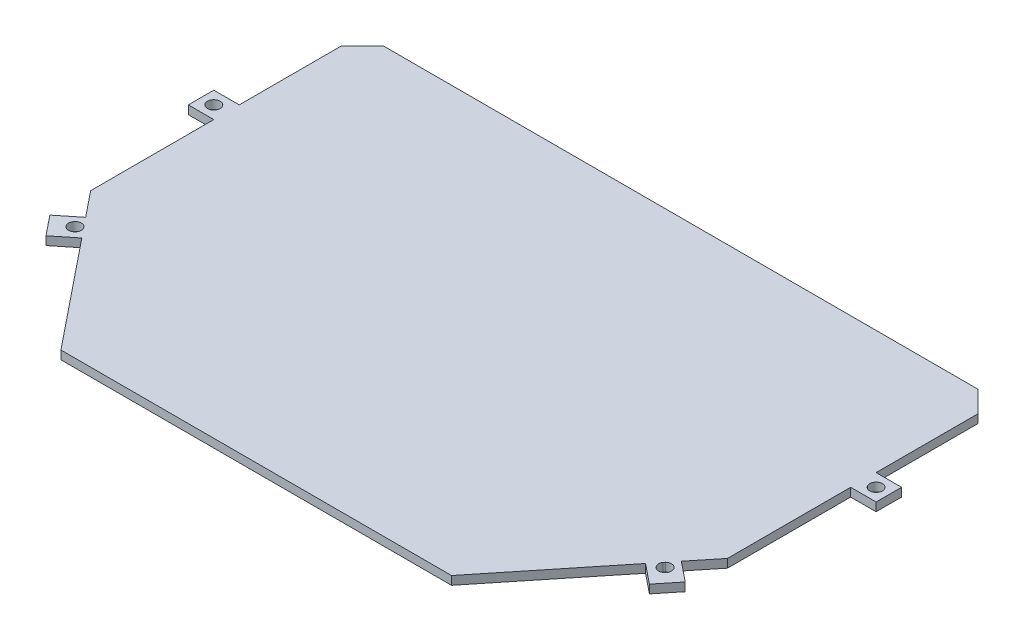
ISO-10303-21;
HEADER;
FILE_DESCRIPTION(('STEP AP214'),'2;1');
FILE_NAME('part.step','',(''),(''),'','','');
FILE_SCHEMA(('AUTOMOTIVE_DESIGN { 1 0 10303 214 1 1 1 1 }'));
ENDSEC;
DATA;
#1=APPLICATION_CONTEXT('core data for automotive mechanical design processes');
#2=APPLICATION_PROTOCOL_DEFINITION('international standard','automotive_design',2000,#1);
#3=PRODUCT_CONTEXT('',#1,'mechanical');
#4=PRODUCT('Part','Part','',(#3));
#5=PRODUCT_RELATED_PRODUCT_CATEGORY('part','',(#4));
#6=PRODUCT_DEFINITION_FORMATION('','',#4);
#7=PRODUCT_DEFINITION_CONTEXT('part definition',#1,'design');
#8=PRODUCT_DEFINITION('design','',#6,#7);
#9=PRODUCT_DEFINITION_SHAPE('','',#8);
#10=(LENGTH_UNIT() NAMED_UNIT(*) SI_UNIT(.MILLI.,.METRE.));
#11=(NAMED_UNIT(*) PLANE_ANGLE_UNIT() SI_UNIT($,.RADIAN.));
#12=(NAMED_UNIT(*) SI_UNIT($,.STERADIAN.) SOLID_ANGLE_UNIT());
#13=UNCERTAINTY_MEASURE_WITH_UNIT(LENGTH_MEASURE(1.E-05),#10,'distance_accuracy_value','');
#14=(GEOMETRIC_REPRESENTATION_CONTEXT(3) GLOBAL_UNCERTAINTY_ASSIGNED_CONTEXT((#13)) GLOBAL_UNIT_ASSIGNED_CONTEXT((#10,
#11,#12)) REPRESENTATION_CONTEXT('',''));
#15=CARTESIAN_POINT('',(0.,0.,0.));
#16=DIRECTION('',(0.,0.,1.));
#17=DIRECTION('',(1.,0.,0.));
#18=AXIS2_PLACEMENT_3D('',#15,#16,#17);
#19=CARTESIAN_POINT('',(-46.,2.,65.));
#20=DIRECTION('',(0.778753909083283,0.,-0.627329537872645));
#21=DIRECTION('',(-0.627329537872645,0.,-0.778753909083283));
#22=AXIS2_PLACEMENT_3D('',#19,#20,#21);
#23=PLANE('',#22);
#24=DIRECTION('',(0.,1.,0.));
#25=VECTOR('',#24,1.);
#26=CARTESIAN_POINT('',(-66.388209980861,-11.9310136830803,39.6904979547933));
#27=LINE('',#26,#25);
#28=CARTESIAN_POINT('',(-66.388209980861,0.,39.6904979547933));
#29=VERTEX_POINT('',#28);
#30=CARTESIAN_POINT('',(-66.3882099808609,2.,39.6904979547933));
#31=VERTEX_POINT('',#30);
#32=EDGE_CURVE('E235',#29,#31,#27,.T.);
#33=ORIENTED_EDGE('',*,*,#32,.F.);
#34=DIRECTION('',(0.627329537872645,0.,0.778753909083283));
#35=VECTOR('',#34,1.);
#36=CARTESIAN_POINT('',(-46.,0.,65.));
#37=LINE('',#36,#35);
#38=CARTESIAN_POINT('',(-46.,0.,65.));
#39=VERTEX_POINT('',#38);
#40=EDGE_CURVE('E334',#29,#39,#37,.T.);
#41=ORIENTED_EDGE('',*,*,#40,.T.);
#42=DIRECTION('',(0.,-1.,0.));
#43=VECTOR('',#42,1.);
#44=CARTESIAN_POINT('',(-46.,2.,65.));
#45=LINE('',#44,#43);
#46=CARTESIAN_POINT('',(-46.,2.,65.));
#47=VERTEX_POINT('',#46);
#48=EDGE_CURVE('E355',#47,#39,#45,.T.);
#49=ORIENTED_EDGE('',*,*,#48,.F.);
#50=DIRECTION('',(0.627329537872645,0.,0.778753909083283));
#51=VECTOR('',#50,1.);
#52=CARTESIAN_POINT('',(-46.,2.,65.));
#53=LINE('',#52,#51);
#54=EDGE_CURVE('E53',#31,#47,#53,.T.);
#55=ORIENTED_EDGE('',*,*,#54,.F.);
#56=EDGE_LOOP('',(#33,#41,#49,#55));
#57=FACE_BOUND('',#56,.T.);
#58=ADVANCED_FACE('F36',(#57),#23,.F.);
#59=CARTESIAN_POINT('',(-75.,0.,29.));
#60=VERTEX_POINT('',#59);
#61=CARTESIAN_POINT('',(-70.1521872080968,0.,35.0179745002936));
#62=VERTEX_POINT('',#61);
#63=EDGE_CURVE('E329',#60,#62,#37,.T.);
#64=ORIENTED_EDGE('',*,*,#63,.T.);
#65=DIRECTION('',(0.,1.,0.));
#66=VECTOR('',#65,1.);
#67=CARTESIAN_POINT('',(-70.1521872080968,-11.9310136830803,35.0179745002936));
#68=LINE('',#67,#66);
#69=CARTESIAN_POINT('',(-70.1521872080968,2.,35.0179745002936));
#70=VERTEX_POINT('',#69);
#71=EDGE_CURVE('E247',#62,#70,#68,.T.);
#72=ORIENTED_EDGE('',*,*,#71,.T.);
#73=CARTESIAN_POINT('',(-75.,2.,29.));
#74=VERTEX_POINT('',#73);
#75=EDGE_CURVE('E387',#74,#70,#53,.T.);
#76=ORIENTED_EDGE('',*,*,#75,.F.);
#77=DIRECTION('',(0.,-1.,0.));
#78=VECTOR('',#77,1.);
#79=CARTESIAN_POINT('',(-75.,2.,29.));
#80=LINE('',#79,#78);
#81=EDGE_CURVE('E351',#74,#60,#80,.T.);
#82=ORIENTED_EDGE('',*,*,#81,.T.);
#83=EDGE_LOOP('',(#64,#72,#76,#82));
#84=FACE_BOUND('',#83,.T.);
#85=ADVANCED_FACE('F544',(#84),#23,.F.);
#86=CARTESIAN_POINT('',(-75.,2.,29.));
#87=DIRECTION('',(1.,0.,0.));
#88=DIRECTION('',(0.,0.,-1.));
#89=AXIS2_PLACEMENT_3D('',#86,#87,#88);
#90=PLANE('',#89);
#91=DIRECTION('',(0.,1.,0.));
#92=VECTOR('',#91,1.);
#93=CARTESIAN_POINT('',(-75.,-11.9310136830803,0.));
#94=LINE('',#93,#92);
#95=CARTESIAN_POINT('',(-75.,0.,0.));
#96=VERTEX_POINT('',#95);
#97=CARTESIAN_POINT('',(-75.,2.,0.));
#98=VERTEX_POINT('',#97);
#99=EDGE_CURVE('E286',#96,#98,#94,.T.);
#100=ORIENTED_EDGE('',*,*,#99,.F.);
#101=DIRECTION('',(0.,0.,1.));
#102=VECTOR('',#101,1.);
#103=CARTESIAN_POINT('',(-75.,0.,29.));
#104=LINE('',#103,#102);
#105=EDGE_CURVE('E318',#96,#60,#104,.T.);
#106=ORIENTED_EDGE('',*,*,#105,.T.);
#107=ORIENTED_EDGE('',*,*,#81,.F.);
#108=DIRECTION('',(0.,0.,1.));
#109=VECTOR('',#108,1.);
#110=CARTESIAN_POINT('',(-75.,2.,29.));
#111=LINE('',#110,#109);
#112=EDGE_CURVE('E395',#98,#74,#111,.T.);
#113=ORIENTED_EDGE('',*,*,#112,.F.);
#114=EDGE_LOOP('',(#100,#106,#107,#113));
#115=FACE_BOUND('',#114,.T.);
#116=ADVANCED_FACE('F550',(#115),#90,.F.);
#117=CARTESIAN_POINT('',(75.,2.,29.));
#118=DIRECTION('',(-0.778753909083283,0.,-0.627329537872644));
#119=DIRECTION('',(-0.627329537872644,0.,0.778753909083283));
#120=AXIS2_PLACEMENT_3D('',#117,#118,#119);
#121=PLANE('',#120);
#122=DIRECTION('',(0.,1.,0.));
#123=VECTOR('',#122,1.);
#124=CARTESIAN_POINT('',(68.2008387655957,-11.9310136830803,37.4403380840881));
#125=LINE('',#124,#123);
#126=CARTESIAN_POINT('',(68.2008387655957,0.,37.4403380840881));
#127=VERTEX_POINT('',#126);
#128=CARTESIAN_POINT('',(68.2008387655957,2.,37.4403380840881));
#129=VERTEX_POINT('',#128);
#130=EDGE_CURVE('E290',#127,#129,#125,.T.);
#131=ORIENTED_EDGE('',*,*,#130,.F.);
#132=DIRECTION('',(0.627329537872644,0.,-0.778753909083283));
#133=VECTOR('',#132,1.);
#134=CARTESIAN_POINT('',(75.,0.,29.));
#135=LINE('',#134,#133);
#136=CARTESIAN_POINT('',(68.4820478943575,0.,37.0912508897631));
#137=VERTEX_POINT('',#136);
#138=EDGE_CURVE('E340',#127,#137,#135,.T.);
#139=ORIENTED_EDGE('',*,*,#138,.T.);
#140=DIRECTION('',(0.,1.,0.));
#141=VECTOR('',#140,1.);
#142=CARTESIAN_POINT('',(68.4820478943575,-11.9310136830803,37.0912508897631));
#143=LINE('',#142,#141);
#144=CARTESIAN_POINT('',(68.4820478943575,2.,37.0912508897631));
#145=VERTEX_POINT('',#144);
#146=EDGE_CURVE('E472',#137,#145,#143,.T.);
#147=ORIENTED_EDGE('',*,*,#146,.T.);
#148=DIRECTION('',(0.627329537872644,0.,-0.778753909083283));
#149=VECTOR('',#148,1.);
#150=CARTESIAN_POINT('',(75.,2.,29.));
#151=LINE('',#150,#149);
#152=EDGE_CURVE('E383',#129,#145,#151,.T.);
#153=ORIENTED_EDGE('',*,*,#152,.F.);
#154=EDGE_LOOP('',(#131,#139,#147,#153));
#155=FACE_BOUND('',#154,.T.);
#156=ADVANCED_FACE('F518',(#155),#121,.F.);
#157=DIRECTION('',(0.,1.,0.));
#158=VECTOR('',#157,1.);
#159=CARTESIAN_POINT('',(70.1521872080968,-11.9310136830803,35.0179745002936));
#160=LINE('',#159,#158);
#161=CARTESIAN_POINT('',(70.1521872080968,0.,35.0179745002936));
#162=VERTEX_POINT('',#161);
#163=CARTESIAN_POINT('',(70.1521872080968,2.,35.0179745002936));
#164=VERTEX_POINT('',#163);
#165=EDGE_CURVE('E469',#162,#164,#160,.T.);
#166=ORIENTED_EDGE('',*,*,#165,.F.);
#167=CARTESIAN_POINT('',(75.,0.,29.));
#168=VERTEX_POINT('',#167);
#169=EDGE_CURVE('E336',#162,#168,#135,.T.);
#170=ORIENTED_EDGE('',*,*,#169,.T.);
#171=DIRECTION('',(0.,-1.,0.));
#172=VECTOR('',#171,1.);
#173=CARTESIAN_POINT('',(75.,2.,29.));
#174=LINE('',#173,#172);
#175=CARTESIAN_POINT('',(75.,2.,29.));
#176=VERTEX_POINT('',#175);
#177=EDGE_CURVE('E360',#176,#168,#174,.T.);
#178=ORIENTED_EDGE('',*,*,#177,.F.);
#179=EDGE_CURVE('E384',#164,#176,#151,.T.);
#180=ORIENTED_EDGE('',*,*,#179,.F.);
#181=EDGE_LOOP('',(#166,#170,#178,#180));
#182=FACE_BOUND('',#181,.T.);
#183=ADVANCED_FACE('F507',(#182),#121,.F.);
#184=CARTESIAN_POINT('',(75.,2.,-35.));
#185=DIRECTION('',(-1.,0.,0.));
#186=DIRECTION('',(0.,0.,1.));
#187=AXIS2_PLACEMENT_3D('',#184,#185,#186);
#188=PLANE('',#187);
#189=DIRECTION('',(0.,0.,-1.));
#190=VECTOR('',#189,1.);
#191=CARTESIAN_POINT('',(75.,0.,-35.));
#192=LINE('',#191,#190);
#193=CARTESIAN_POINT('',(75.,0.,-6.));
#194=VERTEX_POINT('',#193);
#195=CARTESIAN_POINT('',(75.,0.,-30.));
#196=VERTEX_POINT('',#195);
#197=EDGE_CURVE('E339',#194,#196,#192,.T.);
#198=ORIENTED_EDGE('',*,*,#197,.T.);
#199=DIRECTION('',(0.,1.,0.));
#200=VECTOR('',#199,1.);
#201=CARTESIAN_POINT('',(75.,2.,-30.));
#202=LINE('',#201,#200);
#203=CARTESIAN_POINT('',(75.,2.,-30.));
#204=VERTEX_POINT('',#203);
#205=EDGE_CURVE('E402',#196,#204,#202,.T.);
#206=ORIENTED_EDGE('',*,*,#205,.T.);
#207=DIRECTION('',(0.,0.,-1.));
#208=VECTOR('',#207,1.);
#209=CARTESIAN_POINT('',(75.,2.,-35.));
#210=LINE('',#209,#208);
#211=CARTESIAN_POINT('',(75.,2.,-6.));
#212=VERTEX_POINT('',#211);
#213=EDGE_CURVE('E371',#212,#204,#210,.T.);
#214=ORIENTED_EDGE('',*,*,#213,.F.);
#215=DIRECTION('',(0.,1.,0.));
#216=VECTOR('',#215,1.);
#217=CARTESIAN_POINT('',(75.,-11.9310136830803,-6.));
#218=LINE('',#217,#216);
#219=EDGE_CURVE('E426',#194,#212,#218,.T.);
#220=ORIENTED_EDGE('',*,*,#219,.F.);
#221=EDGE_LOOP('',(#198,#206,#214,#220));
#222=FACE_BOUND('',#221,.T.);
#223=ADVANCED_FACE('F563',(#222),#188,.F.);
#224=CARTESIAN_POINT('',(-75.,0.,-30.));
#225=VERTEX_POINT('',#224);
#226=CARTESIAN_POINT('',(-75.,0.,-6.));
#227=VERTEX_POINT('',#226);
#228=EDGE_CURVE('E321',#225,#227,#104,.T.);
#229=ORIENTED_EDGE('',*,*,#228,.T.);
#230=DIRECTION('',(0.,1.,0.));
#231=VECTOR('',#230,1.);
#232=CARTESIAN_POINT('',(-75.,-11.9310136830803,-6.));
#233=LINE('',#232,#231);
#234=CARTESIAN_POINT('',(-75.,2.,-6.));
#235=VERTEX_POINT('',#234);
#236=EDGE_CURVE('E293',#227,#235,#233,.T.);
#237=ORIENTED_EDGE('',*,*,#236,.T.);
#238=CARTESIAN_POINT('',(-75.,2.,-30.));
#239=VERTEX_POINT('',#238);
#240=EDGE_CURVE('E397',#239,#235,#111,.T.);
#241=ORIENTED_EDGE('',*,*,#240,.F.);
#242=DIRECTION('',(0.,-1.,0.));
#243=VECTOR('',#242,1.);
#244=CARTESIAN_POINT('',(-75.,2.,-30.));
#245=LINE('',#244,#243);
#246=EDGE_CURVE('E11',#239,#225,#245,.T.);
#247=ORIENTED_EDGE('',*,*,#246,.T.);
#248=EDGE_LOOP('',(#229,#237,#241,#247));
#249=FACE_BOUND('',#248,.T.);
#250=ADVANCED_FACE('F556',(#249),#90,.F.);
#251=CARTESIAN_POINT('',(-68.4820478943574,2.,37.0912508897632));
#252=VERTEX_POINT('',#251);
#253=CARTESIAN_POINT('',(-68.2008387655958,2.,37.440338084088));
#254=VERTEX_POINT('',#253);
#255=EDGE_CURVE('E389',#252,#254,#53,.T.);
#256=ORIENTED_EDGE('',*,*,#255,.F.);
#257=DIRECTION('',(0.,1.,0.));
#258=VECTOR('',#257,1.);
#259=CARTESIAN_POINT('',(-68.4820478943575,-11.9310136830803,37.0912508897631));
#260=LINE('',#259,#258);
#261=CARTESIAN_POINT('',(-68.4820478943575,0.,37.0912508897631));
#262=VERTEX_POINT('',#261);
#263=EDGE_CURVE('E260',#262,#252,#260,.T.);
#264=ORIENTED_EDGE('',*,*,#263,.F.);
#265=CARTESIAN_POINT('',(-68.2008387655958,0.,37.440338084088));
#266=VERTEX_POINT('',#265);
#267=EDGE_CURVE('E333',#262,#266,#37,.T.);
#268=ORIENTED_EDGE('',*,*,#267,.T.);
#269=DIRECTION('',(0.,1.,0.));
#270=VECTOR('',#269,1.);
#271=CARTESIAN_POINT('',(-68.2008387655957,-11.9310136830803,37.4403380840881));
#272=LINE('',#271,#270);
#273=EDGE_CURVE('E61',#266,#254,#272,.T.);
#274=ORIENTED_EDGE('',*,*,#273,.T.);
#275=EDGE_LOOP('',(#256,#264,#268,#274));
#276=FACE_BOUND('',#275,.T.);
#277=ADVANCED_FACE('F546',(#276),#23,.F.);
#278=CARTESIAN_POINT('',(46.,2.,65.));
#279=DIRECTION('',(0.,0.,-1.));
#280=DIRECTION('',(-1.,0.,0.));
#281=AXIS2_PLACEMENT_3D('',#278,#279,#280);
#282=PLANE('',#281);
#283=DIRECTION('',(1.,0.,0.));
#284=VECTOR('',#283,1.);
#285=CARTESIAN_POINT('',(46.,0.,65.));
#286=LINE('',#285,#284);
#287=CARTESIAN_POINT('',(46.,0.,65.));
#288=VERTEX_POINT('',#287);
#289=EDGE_CURVE('E332',#39,#288,#286,.T.);
#290=ORIENTED_EDGE('',*,*,#289,.T.);
#291=DIRECTION('',(0.,-1.,0.));
#292=VECTOR('',#291,1.);
#293=CARTESIAN_POINT('',(46.,2.,65.));
#294=LINE('',#293,#292);
#295=CARTESIAN_POINT('',(46.,2.,65.));
#296=VERTEX_POINT('',#295);
#297=EDGE_CURVE('E358',#296,#288,#294,.T.);
#298=ORIENTED_EDGE('',*,*,#297,.F.);
#299=DIRECTION('',(1.,0.,0.));
#300=VECTOR('',#299,1.);
#301=CARTESIAN_POINT('',(46.,2.,65.));
#302=LINE('',#301,#300);
#303=EDGE_CURVE('E385',#47,#296,#302,.T.);
#304=ORIENTED_EDGE('',*,*,#303,.F.);
#305=ORIENTED_EDGE('',*,*,#48,.T.);
#306=EDGE_LOOP('',(#290,#298,#304,#305));
#307=FACE_BOUND('',#306,.T.);
#308=ADVANCED_FACE('F555',(#307),#282,.F.);
#309=CARTESIAN_POINT('',(66.388209980861,0.,39.6904979547933));
#310=VERTEX_POINT('',#309);
#311=EDGE_CURVE('E337',#288,#310,#135,.T.);
#312=ORIENTED_EDGE('',*,*,#311,.T.);
#313=DIRECTION('',(0.,1.,0.));
#314=VECTOR('',#313,1.);
#315=CARTESIAN_POINT('',(66.388209980861,-11.9310136830803,39.6904979547933));
#316=LINE('',#315,#314);
#317=CARTESIAN_POINT('',(66.388209980861,2.,39.6904979547933));
#318=VERTEX_POINT('',#317);
#319=EDGE_CURVE('E459',#310,#318,#316,.T.);
#320=ORIENTED_EDGE('',*,*,#319,.T.);
#321=EDGE_CURVE('E375',#296,#318,#151,.T.);
#322=ORIENTED_EDGE('',*,*,#321,.F.);
#323=ORIENTED_EDGE('',*,*,#297,.T.);
#324=EDGE_LOOP('',(#312,#320,#322,#323));
#325=FACE_BOUND('',#324,.T.);
#326=ADVANCED_FACE('F561',(#325),#121,.F.);
#327=CARTESIAN_POINT('',(75.,0.,0.));
#328=VERTEX_POINT('',#327);
#329=EDGE_CURVE('E349',#168,#328,#192,.T.);
#330=ORIENTED_EDGE('',*,*,#329,.T.);
#331=DIRECTION('',(0.,1.,0.));
#332=VECTOR('',#331,1.);
#333=CARTESIAN_POINT('',(75.,-11.9310136830803,0.));
#334=LINE('',#333,#332);
#335=CARTESIAN_POINT('',(75.,2.,0.));
#336=VERTEX_POINT('',#335);
#337=EDGE_CURVE('E416',#328,#336,#334,.T.);
#338=ORIENTED_EDGE('',*,*,#337,.T.);
#339=EDGE_CURVE('E367',#176,#336,#210,.T.);
#340=ORIENTED_EDGE('',*,*,#339,.F.);
#341=ORIENTED_EDGE('',*,*,#177,.T.);
#342=EDGE_LOOP('',(#330,#338,#340,#341));
#343=FACE_BOUND('',#342,.T.);
#344=ADVANCED_FACE('F576',(#343),#188,.F.);
#345=CARTESIAN_POINT('',(-75.,2.,-35.));
#346=DIRECTION('',(0.,0.,1.));
#347=DIRECTION('',(1.,0.,0.));
#348=AXIS2_PLACEMENT_3D('',#345,#346,#347);
#349=PLANE('',#348);
#350=DIRECTION('',(-1.,0.,0.));
#351=VECTOR('',#350,1.);
#352=CARTESIAN_POINT('',(-75.,2.,-35.));
#353=LINE('',#352,#351);
#354=CARTESIAN_POINT('',(70.,2.,-35.));
#355=VERTEX_POINT('',#354);
#356=CARTESIAN_POINT('',(-70.,2.,-35.));
#357=VERTEX_POINT('',#356);
#358=EDGE_CURVE('E327',#355,#357,#353,.T.);
#359=ORIENTED_EDGE('',*,*,#358,.F.);
#360=DIRECTION('',(0.,-1.,0.));
#361=VECTOR('',#360,1.);
#362=CARTESIAN_POINT('',(70.,2.,-35.));
#363=LINE('',#362,#361);
#364=CARTESIAN_POINT('',(70.,0.,-35.));
#365=VERTEX_POINT('',#364);
#366=EDGE_CURVE('E408',#355,#365,#363,.T.);
#367=ORIENTED_EDGE('',*,*,#366,.T.);
#368=DIRECTION('',(-1.,0.,0.));
#369=VECTOR('',#368,1.);
#370=CARTESIAN_POINT('',(-75.,0.,-35.));
#371=LINE('',#370,#369);
#372=CARTESIAN_POINT('',(-70.,0.,-35.));
#373=VERTEX_POINT('',#372);
#374=EDGE_CURVE('E343',#365,#373,#371,.T.);
#375=ORIENTED_EDGE('',*,*,#374,.T.);
#376=DIRECTION('',(0.,1.,0.));
#377=VECTOR('',#376,1.);
#378=CARTESIAN_POINT('',(-70.,2.,-35.));
#379=LINE('',#378,#377);
#380=EDGE_CURVE('E354',#373,#357,#379,.T.);
#381=ORIENTED_EDGE('',*,*,#380,.T.);
#382=EDGE_LOOP('',(#359,#367,#375,#381));
#383=FACE_BOUND('',#382,.T.);
#384=ADVANCED_FACE('F571',(#383),#349,.F.);
#385=CARTESIAN_POINT('',(-75.,2.,-35.));
#386=DIRECTION('',(0.,-1.,0.));
#387=DIRECTION('',(0.,0.,-1.));
#388=AXIS2_PLACEMENT_3D('',#385,#386,#387);
#389=PLANE('',#388);
#390=ORIENTED_EDGE('',*,*,#75,.T.);
#391=DIRECTION('',(-0.778753909083286,0.,0.627329537872641));
#392=VECTOR('',#391,1.);
#393=CARTESIAN_POINT('',(67.2967306871452,2.,-75.7047649153171));
#394=LINE('',#393,#392);
#395=CARTESIAN_POINT('',(-74.8247106625965,2.,38.7819517275294));
#396=VERTEX_POINT('',#395);
#397=EDGE_CURVE('E246',#70,#396,#394,.T.);
#398=ORIENTED_EDGE('',*,*,#397,.T.);
#399=DIRECTION('',(0.627329537872643,0.,0.778753909083284));
#400=VECTOR('',#399,1.);
#401=CARTESIAN_POINT('',(-1.7569833697024,2.,129.486716642847));
#402=LINE('',#401,#400);
#403=CARTESIAN_POINT('',(-71.0607334353607,2.,43.4544751820291));
#404=VERTEX_POINT('',#403);
#405=EDGE_CURVE('E230',#396,#404,#402,.T.);
#406=ORIENTED_EDGE('',*,*,#405,.T.);
#407=DIRECTION('',(-0.778753909083284,0.,0.627329537872643));
#408=VECTOR('',#407,1.);
#409=CARTESIAN_POINT('',(71.0607079143806,2.,-71.0322414608175));
#410=LINE('',#409,#408);
#411=EDGE_CURVE('E238',#31,#404,#410,.T.);
#412=ORIENTED_EDGE('',*,*,#411,.F.);
#413=ORIENTED_EDGE('',*,*,#54,.T.);
#414=ORIENTED_EDGE('',*,*,#303,.T.);
#415=ORIENTED_EDGE('',*,*,#321,.T.);
#416=DIRECTION('',(0.778753909083284,0.,0.627329537872643));
#417=VECTOR('',#416,1.);
#418=CARTESIAN_POINT('',(-71.0607079143806,2.,-71.0322414608175));
#419=LINE('',#418,#417);
#420=CARTESIAN_POINT('',(71.0607334353607,2.,43.4544751820291));
#421=VERTEX_POINT('',#420);
#422=EDGE_CURVE('E461',#318,#421,#419,.T.);
#423=ORIENTED_EDGE('',*,*,#422,.T.);
#424=DIRECTION('',(-0.627329537872643,0.,0.778753909083284));
#425=VECTOR('',#424,1.);
#426=CARTESIAN_POINT('',(1.7569833697024,2.,129.486716642847));
#427=LINE('',#426,#425);
#428=CARTESIAN_POINT('',(74.8247106625965,2.,38.7819517275294));
#429=VERTEX_POINT('',#428);
#430=EDGE_CURVE('E467',#429,#421,#427,.T.);
#431=ORIENTED_EDGE('',*,*,#430,.F.);
#432=DIRECTION('',(0.778753909083286,0.,0.627329537872641));
#433=VECTOR('',#432,1.);
#434=CARTESIAN_POINT('',(-67.2967306871452,2.,-75.7047649153171));
#435=LINE('',#434,#433);
#436=EDGE_CURVE('E468',#164,#429,#435,.T.);
#437=ORIENTED_EDGE('',*,*,#436,.F.);
#438=ORIENTED_EDGE('',*,*,#179,.T.);
#439=ORIENTED_EDGE('',*,*,#339,.T.);
#440=DIRECTION('',(-1.,0.,0.));
#441=VECTOR('',#440,1.);
#442=CARTESIAN_POINT('',(-140.364457980039,2.,0.));
#443=LINE('',#442,#441);
#444=CARTESIAN_POINT('',(81.,2.,0.));
#445=VERTEX_POINT('',#444);
#446=EDGE_CURVE('E414',#445,#336,#443,.T.);
#447=ORIENTED_EDGE('',*,*,#446,.F.);
#448=DIRECTION('',(0.,0.,1.));
#449=VECTOR('',#448,1.);
#450=CARTESIAN_POINT('',(81.,2.,15.));
#451=LINE('',#450,#449);
#452=CARTESIAN_POINT('',(81.,2.,-6.));
#453=VERTEX_POINT('',#452);
#454=EDGE_CURVE('E453',#453,#445,#451,.T.);
#455=ORIENTED_EDGE('',*,*,#454,.F.);
#456=DIRECTION('',(1.,0.,0.));
#457=VECTOR('',#456,1.);
#458=CARTESIAN_POINT('',(-140.364457980039,2.,-6.));
#459=LINE('',#458,#457);
#460=EDGE_CURVE('E437',#212,#453,#459,.T.);
#461=ORIENTED_EDGE('',*,*,#460,.F.);
#462=ORIENTED_EDGE('',*,*,#213,.T.);
#463=DIRECTION('',(0.707106781186549,0.,0.707106781186546));
#464=VECTOR('',#463,1.);
#465=CARTESIAN_POINT('',(70.,2.,-35.));
#466=LINE('',#465,#464);
#467=EDGE_CURVE('E45',#204,#355,#466,.F.);
#468=ORIENTED_EDGE('',*,*,#467,.T.);
#469=ORIENTED_EDGE('',*,*,#358,.T.);
#470=DIRECTION('',(0.707106781186549,0.,-0.707106781186546));
#471=VECTOR('',#470,1.);
#472=CARTESIAN_POINT('',(-75.,2.,-30.));
#473=LINE('',#472,#471);
#474=EDGE_CURVE('E400',#357,#239,#473,.F.);
#475=ORIENTED_EDGE('',*,*,#474,.T.);
#476=ORIENTED_EDGE('',*,*,#240,.T.);
#477=DIRECTION('',(-1.,0.,0.));
#478=VECTOR('',#477,1.);
#479=CARTESIAN_POINT('',(140.364457980039,2.,-6.));
#480=LINE('',#479,#478);
#481=CARTESIAN_POINT('',(-81.,2.,-6.));
#482=VERTEX_POINT('',#481);
#483=EDGE_CURVE('E287',#235,#482,#480,.T.);
#484=ORIENTED_EDGE('',*,*,#483,.T.);
#485=DIRECTION('',(0.,0.,1.));
#486=VECTOR('',#485,1.);
#487=CARTESIAN_POINT('',(-81.,2.,15.));
#488=LINE('',#487,#486);
#489=CARTESIAN_POINT('',(-81.,2.,0.));
#490=VERTEX_POINT('',#489);
#491=EDGE_CURVE('E283',#482,#490,#488,.T.);
#492=ORIENTED_EDGE('',*,*,#491,.T.);
#493=DIRECTION('',(1.,0.,0.));
#494=VECTOR('',#493,1.);
#495=CARTESIAN_POINT('',(140.364457980039,2.,0.));
#496=LINE('',#495,#494);
#497=EDGE_CURVE('E282',#490,#98,#496,.T.);
#498=ORIENTED_EDGE('',*,*,#497,.T.);
#499=ORIENTED_EDGE('',*,*,#112,.T.);
#500=EDGE_LOOP('',(#390,#398,#406,#412,#413,#414,#415,#423,#431,#437,#438,#439,#447,#455,#461,
#462,#468,#469,#475,#476,#484,#492,#498,#499));
#501=FACE_BOUND('',#500,.T.);
#502=CARTESIAN_POINT('',(-69.49646032,2.,38.19622484));
#503=DIRECTION('',(0.,-1.,0.));
#504=DIRECTION('',(0.,0.,1.));
#505=AXIS2_PLACEMENT_3D('',#502,#503,#504);
#506=CIRCLE('',#505,1.49999999999998);
#507=EDGE_CURVE('E251',#254,#252,#506,.T.);
#508=ORIENTED_EDGE('',*,*,#507,.T.);
#509=ORIENTED_EDGE('',*,*,#255,.T.);
#510=EDGE_LOOP('',(#508,#509));
#511=FACE_BOUND('',#510,.T.);
#512=ORIENTED_EDGE('',*,*,#152,.T.);
#513=CARTESIAN_POINT('',(69.49646032,2.,38.19622484));
#514=DIRECTION('',(0.,1.,0.));
#515=DIRECTION('',(0.,0.,1.));
#516=AXIS2_PLACEMENT_3D('',#513,#514,#515);
#517=CIRCLE('',#516,1.49999999999998);
#518=EDGE_CURVE('E458',#129,#145,#517,.T.);
#519=ORIENTED_EDGE('',*,*,#518,.F.);
#520=EDGE_LOOP('',(#512,#519));
#521=FACE_BOUND('',#520,.T.);
#522=CARTESIAN_POINT('',(78.,2.,-3.));
#523=DIRECTION('',(0.,1.,0.));
#524=DIRECTION('',(0.,0.,1.));
#525=AXIS2_PLACEMENT_3D('',#522,#523,#524);
#526=CIRCLE('',#525,1.5);
#527=CARTESIAN_POINT('',(78.,2.,-1.5));
#528=VERTEX_POINT('',#527);
#529=EDGE_CURVE('E440',#528,#528,#526,.T.);
#530=ORIENTED_EDGE('',*,*,#529,.F.);
#531=EDGE_LOOP('',(#530));
#532=FACE_BOUND('',#531,.T.);
#533=CARTESIAN_POINT('',(-78.,2.,-3.));
#534=DIRECTION('',(0.,-1.,0.));
#535=DIRECTION('',(0.,0.,1.));
#536=AXIS2_PLACEMENT_3D('',#533,#534,#535);
#537=CIRCLE('',#536,1.5);
#538=CARTESIAN_POINT('',(-78.,2.,-1.5));
#539=VERTEX_POINT('',#538);
#540=EDGE_CURVE('E279',#539,#539,#537,.T.);
#541=ORIENTED_EDGE('',*,*,#540,.T.);
#542=EDGE_LOOP('',(#541));
#543=FACE_BOUND('',#542,.T.);
#544=ADVANCED_FACE('F243',(#501,#511,#521,#532,#543),#389,.F.);
#545=CARTESIAN_POINT('',(-75.,0.,-35.));
#546=DIRECTION('',(0.,-1.,0.));
#547=DIRECTION('',(0.,0.,-1.));
#548=AXIS2_PLACEMENT_3D('',#545,#546,#547);
#549=PLANE('',#548);
#550=DIRECTION('',(-0.778753909083286,0.,0.627329537872641));
#551=VECTOR('',#550,1.);
#552=CARTESIAN_POINT('',(67.2967306871452,0.,-75.7047649153171));
#553=LINE('',#552,#551);
#554=CARTESIAN_POINT('',(-74.8247106625965,0.,38.7819517275294));
#555=VERTEX_POINT('',#554);
#556=EDGE_CURVE('E249',#62,#555,#553,.T.);
#557=ORIENTED_EDGE('',*,*,#556,.F.);
#558=ORIENTED_EDGE('',*,*,#63,.F.);
#559=ORIENTED_EDGE('',*,*,#105,.F.);
#560=DIRECTION('',(1.,0.,0.));
#561=VECTOR('',#560,1.);
#562=CARTESIAN_POINT('',(140.364457980039,0.,0.));
#563=LINE('',#562,#561);
#564=CARTESIAN_POINT('',(-81.,0.,0.));
#565=VERTEX_POINT('',#564);
#566=EDGE_CURVE('E275',#565,#96,#563,.T.);
#567=ORIENTED_EDGE('',*,*,#566,.F.);
#568=DIRECTION('',(0.,0.,1.));
#569=VECTOR('',#568,1.);
#570=CARTESIAN_POINT('',(-81.,0.,15.));
#571=LINE('',#570,#569);
#572=CARTESIAN_POINT('',(-81.,0.,-6.));
#573=VERTEX_POINT('',#572);
#574=EDGE_CURVE('E272',#573,#565,#571,.T.);
#575=ORIENTED_EDGE('',*,*,#574,.F.);
#576=DIRECTION('',(-1.,0.,0.));
#577=VECTOR('',#576,1.);
#578=CARTESIAN_POINT('',(140.364457980039,0.,-6.));
#579=LINE('',#578,#577);
#580=EDGE_CURVE('E271',#227,#573,#579,.T.);
#581=ORIENTED_EDGE('',*,*,#580,.F.);
#582=ORIENTED_EDGE('',*,*,#228,.F.);
#583=DIRECTION('',(-0.707106781186549,0.,0.707106781186546));
#584=VECTOR('',#583,1.);
#585=CARTESIAN_POINT('',(-72.5,0.,-32.5));
#586=LINE('',#585,#584);
#587=EDGE_CURVE('E406',#225,#373,#586,.F.);
#588=ORIENTED_EDGE('',*,*,#587,.T.);
#589=ORIENTED_EDGE('',*,*,#374,.F.);
#590=DIRECTION('',(-0.707106781186549,0.,-0.707106781186546));
#591=VECTOR('',#590,1.);
#592=CARTESIAN_POINT('',(-2.5000000000004,0.,-107.5));
#593=LINE('',#592,#591);
#594=EDGE_CURVE('E404',#365,#196,#593,.F.);
#595=ORIENTED_EDGE('',*,*,#594,.T.);
#596=ORIENTED_EDGE('',*,*,#197,.F.);
#597=DIRECTION('',(1.,0.,0.));
#598=VECTOR('',#597,1.);
#599=CARTESIAN_POINT('',(-140.364457980039,0.,-6.));
#600=LINE('',#599,#598);
#601=CARTESIAN_POINT('',(81.,0.,-6.));
#602=VERTEX_POINT('',#601);
#603=EDGE_CURVE('E422',#194,#602,#600,.T.);
#604=ORIENTED_EDGE('',*,*,#603,.T.);
#605=DIRECTION('',(0.,0.,1.));
#606=VECTOR('',#605,1.);
#607=CARTESIAN_POINT('',(81.,0.,15.));
#608=LINE('',#607,#606);
#609=CARTESIAN_POINT('',(81.,0.,0.));
#610=VERTEX_POINT('',#609);
#611=EDGE_CURVE('E423',#602,#610,#608,.T.);
#612=ORIENTED_EDGE('',*,*,#611,.T.);
#613=DIRECTION('',(-1.,0.,0.));
#614=VECTOR('',#613,1.);
#615=CARTESIAN_POINT('',(-140.364457980039,0.,0.));
#616=LINE('',#615,#614);
#617=EDGE_CURVE('E419',#610,#328,#616,.T.);
#618=ORIENTED_EDGE('',*,*,#617,.T.);
#619=ORIENTED_EDGE('',*,*,#329,.F.);
#620=ORIENTED_EDGE('',*,*,#169,.F.);
#621=DIRECTION('',(0.778753909083286,0.,0.627329537872641));
#622=VECTOR('',#621,1.);
#623=CARTESIAN_POINT('',(-67.2967306871452,0.,-75.7047649153171));
#624=LINE('',#623,#622);
#625=CARTESIAN_POINT('',(74.8247106625965,0.,38.7819517275294));
#626=VERTEX_POINT('',#625);
#627=EDGE_CURVE('E477',#162,#626,#624,.T.);
#628=ORIENTED_EDGE('',*,*,#627,.T.);
#629=DIRECTION('',(-0.627329537872643,0.,0.778753909083284));
#630=VECTOR('',#629,1.);
#631=CARTESIAN_POINT('',(1.7569833697024,0.,129.486716642847));
#632=LINE('',#631,#630);
#633=CARTESIAN_POINT('',(71.0607334353607,0.,43.4544751820291));
#634=VERTEX_POINT('',#633);
#635=EDGE_CURVE('E480',#626,#634,#632,.T.);
#636=ORIENTED_EDGE('',*,*,#635,.T.);
#637=DIRECTION('',(0.778753909083284,0.,0.627329537872643));
#638=VECTOR('',#637,1.);
#639=CARTESIAN_POINT('',(-71.0607079143806,0.,-71.0322414608175));
#640=LINE('',#639,#638);
#641=EDGE_CURVE('E464',#310,#634,#640,.T.);
#642=ORIENTED_EDGE('',*,*,#641,.F.);
#643=ORIENTED_EDGE('',*,*,#311,.F.);
#644=ORIENTED_EDGE('',*,*,#289,.F.);
#645=ORIENTED_EDGE('',*,*,#40,.F.);
#646=DIRECTION('',(-0.778753909083284,0.,0.627329537872643));
#647=VECTOR('',#646,1.);
#648=CARTESIAN_POINT('',(71.0607079143806,0.,-71.0322414608175));
#649=LINE('',#648,#647);
#650=CARTESIAN_POINT('',(-71.0607334353607,0.,43.4544751820291));
#651=VERTEX_POINT('',#650);
#652=EDGE_CURVE('E256',#29,#651,#649,.T.);
#653=ORIENTED_EDGE('',*,*,#652,.T.);
#654=DIRECTION('',(0.627329537872643,0.,0.778753909083284));
#655=VECTOR('',#654,1.);
#656=CARTESIAN_POINT('',(-1.7569833697024,0.,129.486716642847));
#657=LINE('',#656,#655);
#658=EDGE_CURVE('E232',#555,#651,#657,.T.);
#659=ORIENTED_EDGE('',*,*,#658,.F.);
#660=EDGE_LOOP('',(#557,#558,#559,#567,#575,#581,#582,#588,#589,#595,#596,#604,#612,#618,#619,
#620,#628,#636,#642,#643,#644,#645,#653,#659));
#661=FACE_BOUND('',#660,.T.);
#662=ORIENTED_EDGE('',*,*,#267,.F.);
#663=CARTESIAN_POINT('',(-69.49646032,0.,38.19622484));
#664=DIRECTION('',(0.,-1.,0.));
#665=DIRECTION('',(0.,0.,-1.));
#666=AXIS2_PLACEMENT_3D('',#663,#664,#665);
#667=CIRCLE('',#666,1.49999999999998);
#668=EDGE_CURVE('E257',#266,#262,#667,.T.);
#669=ORIENTED_EDGE('',*,*,#668,.F.);
#670=EDGE_LOOP('',(#662,#669));
#671=FACE_BOUND('',#670,.T.);
#672=CARTESIAN_POINT('',(69.49646032,0.,38.19622484));
#673=DIRECTION('',(0.,-1.,0.));
#674=DIRECTION('',(0.,0.,-1.));
#675=AXIS2_PLACEMENT_3D('',#672,#673,#674);
#676=CIRCLE('',#675,1.49999999999998);
#677=EDGE_CURVE('E474',#127,#137,#676,.F.);
#678=ORIENTED_EDGE('',*,*,#677,.T.);
#679=ORIENTED_EDGE('',*,*,#138,.F.);
#680=EDGE_LOOP('',(#678,#679));
#681=FACE_BOUND('',#680,.T.);
#682=CARTESIAN_POINT('',(78.,0.,-3.));
#683=DIRECTION('',(0.,-1.,0.));
#684=DIRECTION('',(0.,0.,-1.));
#685=AXIS2_PLACEMENT_3D('',#682,#683,#684);
#686=CIRCLE('',#685,1.5);
#687=CARTESIAN_POINT('',(78.,0.,-1.5));
#688=VERTEX_POINT('',#687);
#689=EDGE_CURVE('E322',#688,#688,#686,.F.);
#690=ORIENTED_EDGE('',*,*,#689,.T.);
#691=EDGE_LOOP('',(#690));
#692=FACE_BOUND('',#691,.T.);
#693=CARTESIAN_POINT('',(-78.,0.,-3.));
#694=DIRECTION('',(0.,-1.,0.));
#695=DIRECTION('',(0.,0.,-1.));
#696=AXIS2_PLACEMENT_3D('',#693,#694,#695);
#697=CIRCLE('',#696,1.5);
#698=CARTESIAN_POINT('',(-78.,0.,-1.5));
#699=VERTEX_POINT('',#698);
#700=EDGE_CURVE('E276',#699,#699,#697,.T.);
#701=ORIENTED_EDGE('',*,*,#700,.F.);
#702=EDGE_LOOP('',(#701));
#703=FACE_BOUND('',#702,.T.);
#704=ADVANCED_FACE('F503',(#661,#671,#681,#692,#703),#549,.T.);
#705=CARTESIAN_POINT('',(-140.364457980039,-11.9310136830803,0.));
#706=DIRECTION('',(0.,0.,-1.));
#707=DIRECTION('',(-1.,0.,0.));
#708=AXIS2_PLACEMENT_3D('',#705,#706,#707);
#709=PLANE('',#708);
#710=ORIENTED_EDGE('',*,*,#617,.F.);
#711=DIRECTION('',(0.,1.,0.));
#712=VECTOR('',#711,1.);
#713=CARTESIAN_POINT('',(81.,-11.9310136830803,0.));
#714=LINE('',#713,#712);
#715=EDGE_CURVE('E392',#610,#445,#714,.T.);
#716=ORIENTED_EDGE('',*,*,#715,.T.);
#717=ORIENTED_EDGE('',*,*,#446,.T.);
#718=ORIENTED_EDGE('',*,*,#337,.F.);
#719=EDGE_LOOP('',(#710,#716,#717,#718));
#720=FACE_BOUND('',#719,.T.);
#721=ADVANCED_FACE('F521',(#720),#709,.F.);
#722=CARTESIAN_POINT('',(-140.364457980039,-11.9310136830803,-6.));
#723=DIRECTION('',(0.,0.,1.));
#724=DIRECTION('',(1.,0.,0.));
#725=AXIS2_PLACEMENT_3D('',#722,#723,#724);
#726=PLANE('',#725);
#727=ORIENTED_EDGE('',*,*,#603,.F.);
#728=ORIENTED_EDGE('',*,*,#219,.T.);
#729=ORIENTED_EDGE('',*,*,#460,.T.);
#730=DIRECTION('',(0.,1.,0.));
#731=VECTOR('',#730,1.);
#732=CARTESIAN_POINT('',(81.,-11.9310136830803,-6.));
#733=LINE('',#732,#731);
#734=EDGE_CURVE('E434',#602,#453,#733,.T.);
#735=ORIENTED_EDGE('',*,*,#734,.F.);
#736=EDGE_LOOP('',(#727,#728,#729,#735));
#737=FACE_BOUND('',#736,.T.);
#738=ADVANCED_FACE('F786',(#737),#726,.F.);
#739=CARTESIAN_POINT('',(78.,-11.9310136830803,-3.));
#740=DIRECTION('',(0.,1.,0.));
#741=DIRECTION('',(0.,0.,1.));
#742=AXIS2_PLACEMENT_3D('',#739,#740,#741);
#743=CYLINDRICAL_SURFACE('',#742,1.5);
#744=CARTESIAN_POINT('',(78.,2.,-1.5));
#745=CARTESIAN_POINT('',(78.,1.97916666666667,-1.5));
#746=CARTESIAN_POINT('',(78.,1.95833333333333,-1.5));
#747=CARTESIAN_POINT('',(78.,1.91666666666666,-1.5));
#748=CARTESIAN_POINT('',(78.,1.89583333333333,-1.5));
#749=CARTESIAN_POINT('',(78.,1.85416666666666,-1.5));
#750=CARTESIAN_POINT('',(78.,1.83333333333333,-1.5));
#751=CARTESIAN_POINT('',(78.,1.79166666666666,-1.5));
#752=CARTESIAN_POINT('',(78.,1.77083333333333,-1.5));
#753=CARTESIAN_POINT('',(78.,1.72916666666666,-1.5));
#754=CARTESIAN_POINT('',(78.,1.70833333333333,-1.5));
#755=CARTESIAN_POINT('',(78.,1.66666666666666,-1.5));
#756=CARTESIAN_POINT('',(78.,1.64583333333333,-1.5));
#757=CARTESIAN_POINT('',(78.,1.60416666666666,-1.5));
#758=CARTESIAN_POINT('',(78.,1.58333333333333,-1.5));
#759=CARTESIAN_POINT('',(78.,1.54166666666666,-1.5));
#760=CARTESIAN_POINT('',(78.,1.52083333333333,-1.5));
#761=CARTESIAN_POINT('',(78.,1.47916666666667,-1.5));
#762=CARTESIAN_POINT('',(78.,1.45833333333333,-1.5));
#763=CARTESIAN_POINT('',(78.,1.41666666666667,-1.5));
#764=CARTESIAN_POINT('',(78.,1.39583333333333,-1.5));
#765=CARTESIAN_POINT('',(78.,1.35416666666667,-1.5));
#766=CARTESIAN_POINT('',(78.,1.33333333333333,-1.5));
#767=CARTESIAN_POINT('',(78.,1.29166666666667,-1.5));
#768=CARTESIAN_POINT('',(78.,1.27083333333333,-1.5));
#769=CARTESIAN_POINT('',(78.,1.22916666666667,-1.5));
#770=CARTESIAN_POINT('',(78.,1.20833333333333,-1.5));
#771=CARTESIAN_POINT('',(78.,1.16666666666667,-1.5));
#772=CARTESIAN_POINT('',(78.,1.14583333333333,-1.5));
#773=CARTESIAN_POINT('',(78.,1.10416666666667,-1.5));
#774=CARTESIAN_POINT('',(78.,1.08333333333333,-1.5));
#775=CARTESIAN_POINT('',(78.,1.04166666666667,-1.5));
#776=CARTESIAN_POINT('',(78.,1.02083333333333,-1.5));
#777=CARTESIAN_POINT('',(78.,0.979166666666666,-1.5));
#778=CARTESIAN_POINT('',(78.,0.958333333333332,-1.5));
#779=CARTESIAN_POINT('',(78.,0.916666666666666,-1.5));
#780=CARTESIAN_POINT('',(78.,0.895833333333332,-1.5));
#781=CARTESIAN_POINT('',(78.,0.854166666666666,-1.5));
#782=CARTESIAN_POINT('',(78.,0.833333333333332,-1.5));
#783=CARTESIAN_POINT('',(78.,0.791666666666666,-1.5));
#784=CARTESIAN_POINT('',(78.,0.770833333333332,-1.5));
#785=CARTESIAN_POINT('',(78.,0.729166666666666,-1.5));
#786=CARTESIAN_POINT('',(78.,0.708333333333332,-1.5));
#787=CARTESIAN_POINT('',(78.,0.666666666666666,-1.5));
#788=CARTESIAN_POINT('',(78.,0.645833333333332,-1.5));
#789=CARTESIAN_POINT('',(78.,0.604166666666666,-1.5));
#790=CARTESIAN_POINT('',(78.,0.583333333333333,-1.5));
#791=CARTESIAN_POINT('',(78.,0.541666666666667,-1.5));
#792=CARTESIAN_POINT('',(78.,0.520833333333334,-1.5));
#793=CARTESIAN_POINT('',(78.,0.479166666666667,-1.5));
#794=CARTESIAN_POINT('',(78.,0.458333333333334,-1.5));
#795=CARTESIAN_POINT('',(78.,0.416666666666667,-1.5));
#796=CARTESIAN_POINT('',(78.,0.395833333333334,-1.5));
#797=CARTESIAN_POINT('',(78.,0.354166666666667,-1.5));
#798=CARTESIAN_POINT('',(78.,0.333333333333334,-1.5));
#799=CARTESIAN_POINT('',(78.,0.291666666666667,-1.5));
#800=CARTESIAN_POINT('',(78.,0.270833333333334,-1.5));
#801=CARTESIAN_POINT('',(78.,0.229166666666667,-1.5));
#802=CARTESIAN_POINT('',(78.,0.208333333333334,-1.5));
#803=CARTESIAN_POINT('',(78.,0.166666666666667,-1.5));
#804=CARTESIAN_POINT('',(78.,0.145833333333333,-1.5));
#805=CARTESIAN_POINT('',(78.,0.104166666666667,-1.5));
#806=CARTESIAN_POINT('',(78.,0.0833333333333334,-1.5));
#807=CARTESIAN_POINT('',(78.,0.0416666666666667,-1.5));
#808=CARTESIAN_POINT('',(78.,0.0208333333333333,-1.5));
#809=CARTESIAN_POINT('',(78.,0.,-1.5));
#810=B_SPLINE_CURVE_WITH_KNOTS('',3,(#744,#745,#746,#747,#748,#749,#750,#751,#752,#753,#754,
#755,#756,#757,#758,#759,#760,#761,#762,#763,#764,#765,#766,#767,#768,#769,#770,#771,#772,#773,
#774,#775,#776,#777,#778,#779,#780,#781,#782,#783,#784,#785,#786,#787,#788,#789,#790,#791,#792,
#793,#794,#795,#796,#797,#798,#799,#800,#801,#802,#803,#804,#805,#806,#807,#808,#809),
.UNSPECIFIED.,.F.,.F.,(4,2,2,2,2,2,2,2,2,2,2,2,2,2,2,2,2,2,2,2,2,2,2,2,2,2,2,2,2,2,2,2,4),(0.,
0.0625000000000001,0.125,0.1875,0.25,0.3125,0.375,0.4375,0.5,0.562499999999999,
0.624999999999999,0.687499999999999,0.749999999999999,0.812499999999999,0.874999999999999,
0.937499999999999,0.999999999999999,1.0625,1.125,1.1875,1.25,1.3125,1.375,1.4375,1.5,1.5625,
1.625,1.6875,1.75,1.8125,1.875,1.9375,2.),.UNSPECIFIED.);
#811=EDGE_CURVE('BSEAM777',#528,#688,#810,.T.);
#812=ORIENTED_EDGE('',*,*,#529,.T.);
#813=ORIENTED_EDGE('',*,*,#689,.F.);
#814=ORIENTED_EDGE('',*,*,#811,.T.);
#815=ORIENTED_EDGE('',*,*,#811,.F.);
#816=EDGE_LOOP('',(#812,#814,#813,#815));
#817=FACE_BOUND('',#816,.T.);
#818=ADVANCED_FACE('F777',(#817),#743,.F.);
#819=CARTESIAN_POINT('',(81.,-11.9310136830803,15.));
#820=DIRECTION('',(-1.,0.,0.));
#821=DIRECTION('',(0.,0.,1.));
#822=AXIS2_PLACEMENT_3D('',#819,#820,#821);
#823=PLANE('',#822);
#824=ORIENTED_EDGE('',*,*,#611,.F.);
#825=ORIENTED_EDGE('',*,*,#734,.T.);
#826=ORIENTED_EDGE('',*,*,#454,.T.);
#827=ORIENTED_EDGE('',*,*,#715,.F.);
#828=EDGE_LOOP('',(#824,#825,#826,#827));
#829=FACE_BOUND('',#828,.T.);
#830=ADVANCED_FACE('F769',(#829),#823,.F.);
#831=CARTESIAN_POINT('',(69.49646032,-11.9310136830803,38.19622484));
#832=DIRECTION('',(0.,1.,0.));
#833=DIRECTION('',(0.,0.,1.));
#834=AXIS2_PLACEMENT_3D('',#831,#832,#833);
#835=CYLINDRICAL_SURFACE('',#834,1.49999999999998);
#836=ORIENTED_EDGE('',*,*,#677,.F.);
#837=ORIENTED_EDGE('',*,*,#130,.T.);
#838=ORIENTED_EDGE('',*,*,#518,.T.);
#839=ORIENTED_EDGE('',*,*,#146,.F.);
#840=EDGE_LOOP('',(#836,#837,#838,#839));
#841=FACE_BOUND('',#840,.T.);
#842=ADVANCED_FACE('F517',(#841),#835,.F.);
#843=CARTESIAN_POINT('',(-67.2967306871452,-11.9310136830803,-75.7047649153171));
#844=DIRECTION('',(-0.627329537872641,0.,0.778753909083286));
#845=DIRECTION('',(0.778753909083286,0.,0.627329537872641));
#846=AXIS2_PLACEMENT_3D('',#843,#844,#845);
#847=PLANE('',#846);
#848=ORIENTED_EDGE('',*,*,#627,.F.);
#849=ORIENTED_EDGE('',*,*,#165,.T.);
#850=ORIENTED_EDGE('',*,*,#436,.T.);
#851=DIRECTION('',(0.,1.,0.));
#852=VECTOR('',#851,1.);
#853=CARTESIAN_POINT('',(74.8247106625965,-11.9310136830803,38.7819517275294));
#854=LINE('',#853,#852);
#855=EDGE_CURVE('E465',#626,#429,#854,.T.);
#856=ORIENTED_EDGE('',*,*,#855,.F.);
#857=EDGE_LOOP('',(#848,#849,#850,#856));
#858=FACE_BOUND('',#857,.T.);
#859=ADVANCED_FACE('F495',(#858),#847,.F.);
#860=CARTESIAN_POINT('',(1.7569833697024,-11.9310136830803,129.486716642847));
#861=DIRECTION('',(-0.778753909083284,0.,-0.627329537872643));
#862=DIRECTION('',(-0.627329537872643,0.,0.778753909083284));
#863=AXIS2_PLACEMENT_3D('',#860,#861,#862);
#864=PLANE('',#863);
#865=ORIENTED_EDGE('',*,*,#635,.F.);
#866=ORIENTED_EDGE('',*,*,#855,.T.);
#867=ORIENTED_EDGE('',*,*,#430,.T.);
#868=DIRECTION('',(0.,1.,0.));
#869=VECTOR('',#868,1.);
#870=CARTESIAN_POINT('',(71.0607334353607,-11.9310136830803,43.4544751820291));
#871=LINE('',#870,#869);
#872=EDGE_CURVE('E462',#634,#421,#871,.T.);
#873=ORIENTED_EDGE('',*,*,#872,.F.);
#874=EDGE_LOOP('',(#865,#866,#867,#873));
#875=FACE_BOUND('',#874,.T.);
#876=ADVANCED_FACE('F500',(#875),#864,.F.);
#877=CARTESIAN_POINT('',(-71.0607079143806,-11.9310136830803,-71.0322414608175));
#878=DIRECTION('',(-0.627329537872643,0.,0.778753909083284));
#879=DIRECTION('',(0.778753909083284,0.,0.627329537872643));
#880=AXIS2_PLACEMENT_3D('',#877,#878,#879);
#881=PLANE('',#880);
#882=ORIENTED_EDGE('',*,*,#319,.F.);
#883=ORIENTED_EDGE('',*,*,#641,.T.);
#884=ORIENTED_EDGE('',*,*,#872,.T.);
#885=ORIENTED_EDGE('',*,*,#422,.F.);
#886=EDGE_LOOP('',(#882,#883,#884,#885));
#887=FACE_BOUND('',#886,.T.);
#888=ADVANCED_FACE('F740',(#887),#881,.T.);
#889=CARTESIAN_POINT('',(70.,2.,-35.));
#890=DIRECTION('',(-0.707106781186545,0.,0.707106781186549));
#891=DIRECTION('',(0.707106781186549,0.,0.707106781186546));
#892=AXIS2_PLACEMENT_3D('',#889,#890,#891);
#893=PLANE('',#892);
#894=ORIENTED_EDGE('',*,*,#467,.F.);
#895=ORIENTED_EDGE('',*,*,#205,.F.);
#896=ORIENTED_EDGE('',*,*,#594,.F.);
#897=ORIENTED_EDGE('',*,*,#366,.F.);
#898=EDGE_LOOP('',(#894,#895,#896,#897));
#899=FACE_BOUND('',#898,.T.);
#900=ADVANCED_FACE('F538',(#899),#893,.F.);
#901=CARTESIAN_POINT('',(-75.,2.,-30.));
#902=DIRECTION('',(0.707106781186546,0.,0.707106781186549));
#903=DIRECTION('',(0.707106781186549,0.,-0.707106781186546));
#904=AXIS2_PLACEMENT_3D('',#901,#902,#903);
#905=PLANE('',#904);
#906=ORIENTED_EDGE('',*,*,#474,.F.);
#907=ORIENTED_EDGE('',*,*,#380,.F.);
#908=ORIENTED_EDGE('',*,*,#587,.F.);
#909=ORIENTED_EDGE('',*,*,#246,.F.);
#910=EDGE_LOOP('',(#906,#907,#908,#909));
#911=FACE_BOUND('',#910,.T.);
#912=ADVANCED_FACE('F38',(#911),#905,.F.);
#913=CARTESIAN_POINT('',(-78.,-11.9310136830803,-3.));
#914=DIRECTION('',(0.,1.,0.));
#915=DIRECTION('',(0.,0.,1.));
#916=AXIS2_PLACEMENT_3D('',#913,#914,#915);
#917=CYLINDRICAL_SURFACE('',#916,1.5);
#918=CARTESIAN_POINT('',(-78.,2.,-1.5));
#919=CARTESIAN_POINT('',(-78.,1.97916666666667,-1.5));
#920=CARTESIAN_POINT('',(-78.,1.95833333333334,-1.5));
#921=CARTESIAN_POINT('',(-78.,1.91666666666667,-1.5));
#922=CARTESIAN_POINT('',(-78.,1.89583333333334,-1.5));
#923=CARTESIAN_POINT('',(-78.,1.85416666666667,-1.5));
#924=CARTESIAN_POINT('',(-78.,1.83333333333334,-1.5));
#925=CARTESIAN_POINT('',(-78.,1.79166666666667,-1.5));
#926=CARTESIAN_POINT('',(-78.,1.77083333333334,-1.5));
#927=CARTESIAN_POINT('',(-78.,1.72916666666667,-1.5));
#928=CARTESIAN_POINT('',(-78.,1.70833333333333,-1.5));
#929=CARTESIAN_POINT('',(-78.,1.66666666666667,-1.5));
#930=CARTESIAN_POINT('',(-78.,1.64583333333333,-1.5));
#931=CARTESIAN_POINT('',(-78.,1.60416666666667,-1.5));
#932=CARTESIAN_POINT('',(-78.,1.58333333333333,-1.5));
#933=CARTESIAN_POINT('',(-78.,1.54166666666667,-1.5));
#934=CARTESIAN_POINT('',(-78.,1.52083333333333,-1.5));
#935=CARTESIAN_POINT('',(-78.,1.47916666666667,-1.5));
#936=CARTESIAN_POINT('',(-78.,1.45833333333333,-1.5));
#937=CARTESIAN_POINT('',(-78.,1.41666666666667,-1.5));
#938=CARTESIAN_POINT('',(-78.,1.39583333333333,-1.5));
#939=CARTESIAN_POINT('',(-78.,1.35416666666667,-1.5));
#940=CARTESIAN_POINT('',(-78.,1.33333333333333,-1.5));
#941=CARTESIAN_POINT('',(-78.,1.29166666666667,-1.5));
#942=CARTESIAN_POINT('',(-78.,1.27083333333333,-1.5));
#943=CARTESIAN_POINT('',(-78.,1.22916666666667,-1.5));
#944=CARTESIAN_POINT('',(-78.,1.20833333333333,-1.5));
#945=CARTESIAN_POINT('',(-78.,1.16666666666667,-1.5));
#946=CARTESIAN_POINT('',(-78.,1.14583333333333,-1.5));
#947=CARTESIAN_POINT('',(-78.,1.10416666666667,-1.5));
#948=CARTESIAN_POINT('',(-78.,1.08333333333333,-1.5));
#949=CARTESIAN_POINT('',(-78.,1.04166666666667,-1.5));
#950=CARTESIAN_POINT('',(-78.,1.02083333333333,-1.5));
#951=CARTESIAN_POINT('',(-78.,0.979166666666668,-1.5));
#952=CARTESIAN_POINT('',(-78.,0.958333333333334,-1.5));
#953=CARTESIAN_POINT('',(-78.,0.916666666666668,-1.5));
#954=CARTESIAN_POINT('',(-78.,0.895833333333334,-1.5));
#955=CARTESIAN_POINT('',(-78.,0.854166666666667,-1.5));
#956=CARTESIAN_POINT('',(-78.,0.833333333333334,-1.5));
#957=CARTESIAN_POINT('',(-78.,0.791666666666667,-1.5));
#958=CARTESIAN_POINT('',(-78.,0.770833333333334,-1.5));
#959=CARTESIAN_POINT('',(-78.,0.729166666666667,-1.5));
#960=CARTESIAN_POINT('',(-78.,0.708333333333334,-1.5));
#961=CARTESIAN_POINT('',(-78.,0.666666666666667,-1.5));
#962=CARTESIAN_POINT('',(-78.,0.645833333333334,-1.5));
#963=CARTESIAN_POINT('',(-78.,0.604166666666667,-1.5));
#964=CARTESIAN_POINT('',(-78.,0.583333333333334,-1.5));
#965=CARTESIAN_POINT('',(-78.,0.541666666666667,-1.5));
#966=CARTESIAN_POINT('',(-78.,0.520833333333334,-1.5));
#967=CARTESIAN_POINT('',(-78.,0.479166666666667,-1.5));
#968=CARTESIAN_POINT('',(-78.,0.458333333333334,-1.5));
#969=CARTESIAN_POINT('',(-78.,0.416666666666667,-1.5));
#970=CARTESIAN_POINT('',(-78.,0.395833333333334,-1.5));
#971=CARTESIAN_POINT('',(-78.,0.354166666666667,-1.5));
#972=CARTESIAN_POINT('',(-78.,0.333333333333334,-1.5));
#973=CARTESIAN_POINT('',(-78.,0.291666666666667,-1.5));
#974=CARTESIAN_POINT('',(-78.,0.270833333333334,-1.5));
#975=CARTESIAN_POINT('',(-78.,0.229166666666667,-1.5));
#976=CARTESIAN_POINT('',(-78.,0.208333333333334,-1.5));
#977=CARTESIAN_POINT('',(-78.,0.166666666666667,-1.5));
#978=CARTESIAN_POINT('',(-78.,0.145833333333333,-1.5));
#979=CARTESIAN_POINT('',(-78.,0.104166666666667,-1.5));
#980=CARTESIAN_POINT('',(-78.,0.0833333333333334,-1.5));
#981=CARTESIAN_POINT('',(-78.,0.0416666666666667,-1.5));
#982=CARTESIAN_POINT('',(-78.,0.0208333333333333,-1.5));
#983=CARTESIAN_POINT('',(-78.,0.,-1.5));
#984=B_SPLINE_CURVE_WITH_KNOTS('',3,(#918,#919,#920,#921,#922,#923,#924,#925,#926,#927,#928,
#929,#930,#931,#932,#933,#934,#935,#936,#937,#938,#939,#940,#941,#942,#943,#944,#945,#946,#947,
#948,#949,#950,#951,#952,#953,#954,#955,#956,#957,#958,#959,#960,#961,#962,#963,#964,#965,#966,
#967,#968,#969,#970,#971,#972,#973,#974,#975,#976,#977,#978,#979,#980,#981,#982,#983),
.UNSPECIFIED.,.F.,.F.,(4,2,2,2,2,2,2,2,2,2,2,2,2,2,2,2,2,2,2,2,2,2,2,2,2,2,2,2,2,2,2,2,4),(0.,
0.0625000000000001,0.125,0.1875,0.25,0.3125,0.375,0.4375,0.5,0.5625,0.625000000000001,
0.687500000000001,0.750000000000001,0.812500000000001,0.875000000000001,0.937500000000001,1.,
1.0625,1.125,1.1875,1.25,1.3125,1.375,1.4375,1.5,1.5625,1.625,1.6875,1.75,1.8125,1.875,1.9375,
2.),.UNSPECIFIED.);
#985=EDGE_CURVE('BSEAM526',#539,#699,#984,.T.);
#986=ORIENTED_EDGE('',*,*,#540,.F.);
#987=ORIENTED_EDGE('',*,*,#700,.T.);
#988=ORIENTED_EDGE('',*,*,#985,.T.);
#989=ORIENTED_EDGE('',*,*,#985,.F.);
#990=EDGE_LOOP('',(#986,#988,#987,#989));
#991=FACE_BOUND('',#990,.T.);
#992=ADVANCED_FACE('F526',(#991),#917,.F.);
#993=CARTESIAN_POINT('',(140.364457980039,-11.9310136830803,-6.));
#994=DIRECTION('',(0.,0.,-1.));
#995=DIRECTION('',(-1.,0.,0.));
#996=AXIS2_PLACEMENT_3D('',#993,#994,#995);
#997=PLANE('',#996);
#998=ORIENTED_EDGE('',*,*,#236,.F.);
#999=ORIENTED_EDGE('',*,*,#580,.T.);
#1000=DIRECTION('',(0.,1.,0.));
#1001=VECTOR('',#1000,1.);
#1002=CARTESIAN_POINT('',(-81.,-11.9310136830803,-6.));
#1003=LINE('',#1002,#1001);
#1004=EDGE_CURVE('E291',#573,#482,#1003,.T.);
#1005=ORIENTED_EDGE('',*,*,#1004,.T.);
#1006=ORIENTED_EDGE('',*,*,#483,.F.);
#1007=EDGE_LOOP('',(#998,#999,#1005,#1006));
#1008=FACE_BOUND('',#1007,.T.);
#1009=ADVANCED_FACE('F528',(#1008),#997,.T.);
#1010=CARTESIAN_POINT('',(-81.,-11.9310136830803,15.));
#1011=DIRECTION('',(-1.,0.,0.));
#1012=DIRECTION('',(0.,0.,1.));
#1013=AXIS2_PLACEMENT_3D('',#1010,#1011,#1012);
#1014=PLANE('',#1013);
#1015=ORIENTED_EDGE('',*,*,#1004,.F.);
#1016=ORIENTED_EDGE('',*,*,#574,.T.);
#1017=DIRECTION('',(0.,1.,0.));
#1018=VECTOR('',#1017,1.);
#1019=CARTESIAN_POINT('',(-81.,-11.9310136830803,0.));
#1020=LINE('',#1019,#1018);
#1021=EDGE_CURVE('E288',#565,#490,#1020,.T.);
#1022=ORIENTED_EDGE('',*,*,#1021,.T.);
#1023=ORIENTED_EDGE('',*,*,#491,.F.);
#1024=EDGE_LOOP('',(#1015,#1016,#1022,#1023));
#1025=FACE_BOUND('',#1024,.T.);
#1026=ADVANCED_FACE('F535',(#1025),#1014,.T.);
#1027=CARTESIAN_POINT('',(140.364457980039,-11.9310136830803,0.));
#1028=DIRECTION('',(0.,0.,1.));
#1029=DIRECTION('',(1.,0.,0.));
#1030=AXIS2_PLACEMENT_3D('',#1027,#1028,#1029);
#1031=PLANE('',#1030);
#1032=ORIENTED_EDGE('',*,*,#1021,.F.);
#1033=ORIENTED_EDGE('',*,*,#566,.T.);
#1034=ORIENTED_EDGE('',*,*,#99,.T.);
#1035=ORIENTED_EDGE('',*,*,#497,.F.);
#1036=EDGE_LOOP('',(#1032,#1033,#1034,#1035));
#1037=FACE_BOUND('',#1036,.T.);
#1038=ADVANCED_FACE('F614',(#1037),#1031,.T.);
#1039=CARTESIAN_POINT('',(67.2967306871452,-11.9310136830803,-75.7047649153171));
#1040=DIRECTION('',(-0.627329537872641,0.,-0.778753909083286));
#1041=DIRECTION('',(-0.778753909083286,0.,0.627329537872641));
#1042=AXIS2_PLACEMENT_3D('',#1039,#1040,#1041);
#1043=PLANE('',#1042);
#1044=ORIENTED_EDGE('',*,*,#71,.F.);
#1045=ORIENTED_EDGE('',*,*,#556,.T.);
#1046=DIRECTION('',(0.,1.,0.));
#1047=VECTOR('',#1046,1.);
#1048=CARTESIAN_POINT('',(-74.8247106625965,-11.9310136830803,38.7819517275294));
#1049=LINE('',#1048,#1047);
#1050=EDGE_CURVE('E263',#555,#396,#1049,.T.);
#1051=ORIENTED_EDGE('',*,*,#1050,.T.);
#1052=ORIENTED_EDGE('',*,*,#397,.F.);
#1053=EDGE_LOOP('',(#1044,#1045,#1051,#1052));
#1054=FACE_BOUND('',#1053,.T.);
#1055=ADVANCED_FACE('F623',(#1054),#1043,.T.);
#1056=CARTESIAN_POINT('',(-1.7569833697024,-11.9310136830803,129.486716642847));
#1057=DIRECTION('',(-0.778753909083284,0.,0.627329537872643));
#1058=DIRECTION('',(0.627329537872643,0.,0.778753909083284));
#1059=AXIS2_PLACEMENT_3D('',#1056,#1057,#1058);
#1060=PLANE('',#1059);
#1061=ORIENTED_EDGE('',*,*,#1050,.F.);
#1062=ORIENTED_EDGE('',*,*,#658,.T.);
#1063=DIRECTION('',(0.,1.,0.));
#1064=VECTOR('',#1063,1.);
#1065=CARTESIAN_POINT('',(-71.0607334353607,-11.9310136830803,43.4544751820291));
#1066=LINE('',#1065,#1064);
#1067=EDGE_CURVE('E225',#651,#404,#1066,.T.);
#1068=ORIENTED_EDGE('',*,*,#1067,.T.);
#1069=ORIENTED_EDGE('',*,*,#405,.F.);
#1070=EDGE_LOOP('',(#1061,#1062,#1068,#1069));
#1071=FACE_BOUND('',#1070,.T.);
#1072=ADVANCED_FACE('F228',(#1071),#1060,.T.);
#1073=CARTESIAN_POINT('',(71.0607079143806,-11.9310136830803,-71.0322414608175));
#1074=DIRECTION('',(-0.627329537872643,0.,-0.778753909083284));
#1075=DIRECTION('',(-0.778753909083284,0.,0.627329537872643));
#1076=AXIS2_PLACEMENT_3D('',#1073,#1074,#1075);
#1077=PLANE('',#1076);
#1078=ORIENTED_EDGE('',*,*,#652,.F.);
#1079=ORIENTED_EDGE('',*,*,#32,.T.);
#1080=ORIENTED_EDGE('',*,*,#411,.T.);
#1081=ORIENTED_EDGE('',*,*,#1067,.F.);
#1082=EDGE_LOOP('',(#1078,#1079,#1080,#1081));
#1083=FACE_BOUND('',#1082,.T.);
#1084=ADVANCED_FACE('F239',(#1083),#1077,.F.);
#1085=CARTESIAN_POINT('',(-69.49646032,-11.9310136830803,38.19622484));
#1086=DIRECTION('',(0.,1.,0.));
#1087=DIRECTION('',(0.,0.,1.));
#1088=AXIS2_PLACEMENT_3D('',#1085,#1086,#1087);
#1089=CYLINDRICAL_SURFACE('',#1088,1.49999999999998);
#1090=ORIENTED_EDGE('',*,*,#273,.F.);
#1091=ORIENTED_EDGE('',*,*,#668,.T.);
#1092=ORIENTED_EDGE('',*,*,#263,.T.);
#1093=ORIENTED_EDGE('',*,*,#507,.F.);
#1094=EDGE_LOOP('',(#1090,#1091,#1092,#1093));
#1095=FACE_BOUND('',#1094,.T.);
#1096=ADVANCED_FACE('F568',(#1095),#1089,.F.);
#1097=CLOSED_SHELL('',(#58,#85,#116,#156,#183,#223,#250,#277,#308,#326,#344,#384,#544,#704,#721,
#738,#818,#830,#842,#859,#876,#888,#900,#912,#992,#1009,#1026,#1038,#1055,#1072,#1084,#1096));
#1098=MANIFOLD_SOLID_BREP('B2',#1097);
#1099=ADVANCED_BREP_SHAPE_REPRESENTATION('',(#18,#1098),#14);
#1100=SHAPE_DEFINITION_REPRESENTATION(#9,#1099);
ENDSEC;
END-ISO-10303-21;
